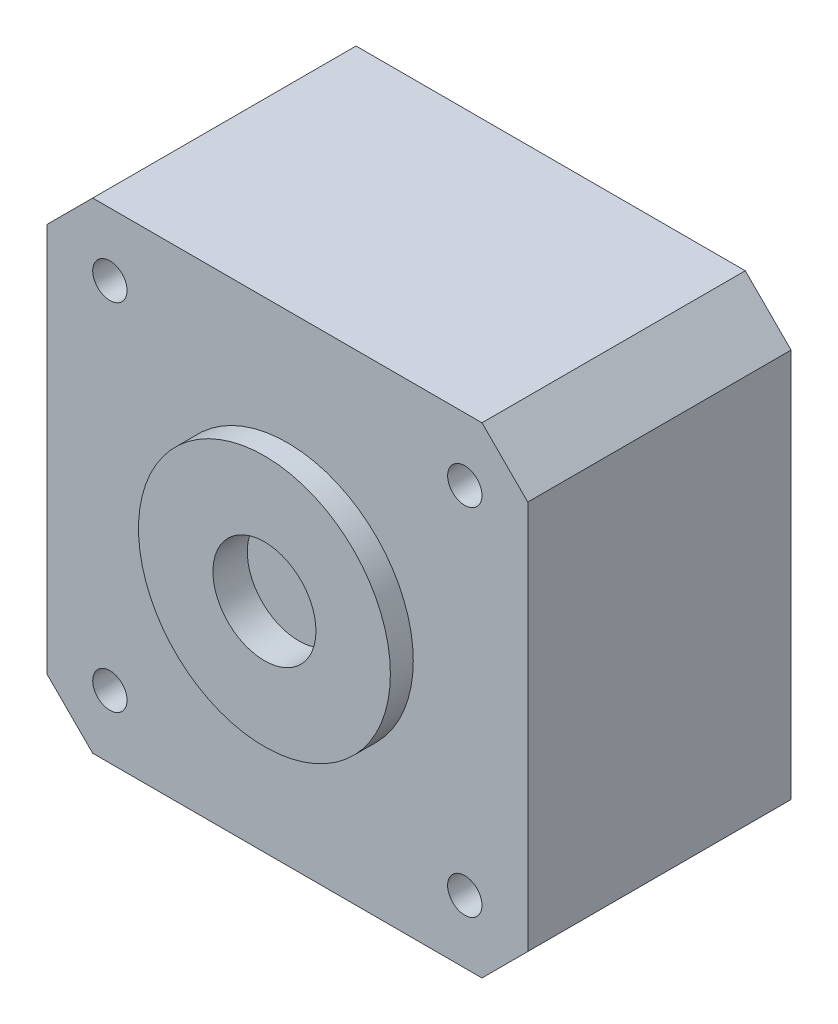
ISO-10303-21;
HEADER;
FILE_DESCRIPTION(('STEP AP214'),'2;1');
FILE_NAME('part.step','',(''),(''),'','','');
FILE_SCHEMA(('AUTOMOTIVE_DESIGN { 1 0 10303 214 1 1 1 1 }'));
ENDSEC;
DATA;
#1=APPLICATION_CONTEXT('core data for automotive mechanical design processes');
#2=APPLICATION_PROTOCOL_DEFINITION('international standard','automotive_design',2000,#1);
#3=PRODUCT_CONTEXT('',#1,'mechanical');
#4=PRODUCT('Part','Part','',(#3));
#5=PRODUCT_RELATED_PRODUCT_CATEGORY('part','',(#4));
#6=PRODUCT_DEFINITION_FORMATION('','',#4);
#7=PRODUCT_DEFINITION_CONTEXT('part definition',#1,'design');
#8=PRODUCT_DEFINITION('design','',#6,#7);
#9=PRODUCT_DEFINITION_SHAPE('','',#8);
#10=(LENGTH_UNIT() NAMED_UNIT(*) SI_UNIT(.MILLI.,.METRE.));
#11=(NAMED_UNIT(*) PLANE_ANGLE_UNIT() SI_UNIT($,.RADIAN.));
#12=(NAMED_UNIT(*) SI_UNIT($,.STERADIAN.) SOLID_ANGLE_UNIT());
#13=UNCERTAINTY_MEASURE_WITH_UNIT(LENGTH_MEASURE(1.E-05),#10,'distance_accuracy_value','');
#14=(GEOMETRIC_REPRESENTATION_CONTEXT(3) GLOBAL_UNCERTAINTY_ASSIGNED_CONTEXT((#13)) GLOBAL_UNIT_ASSIGNED_CONTEXT((#10,
#11,#12)) REPRESENTATION_CONTEXT('',''));
#15=CARTESIAN_POINT('',(0.,0.,0.));
#16=DIRECTION('',(0.,0.,1.));
#17=DIRECTION('',(1.,0.,0.));
#18=AXIS2_PLACEMENT_3D('',#15,#16,#17);
#19=CARTESIAN_POINT('',(15.5,-15.5,23.));
#20=DIRECTION('',(0.,0.,-1.));
#21=DIRECTION('',(-1.,0.,0.));
#22=AXIS2_PLACEMENT_3D('',#19,#20,#21);
#23=CYLINDRICAL_SURFACE('',#22,1.5);
#24=CARTESIAN_POINT('',(15.5,-15.5,23.));
#25=DIRECTION('',(0.,0.,1.));
#26=DIRECTION('',(1.,0.,0.));
#27=AXIS2_PLACEMENT_3D('',#24,#25,#26);
#28=CIRCLE('',#27,1.5);
#29=CARTESIAN_POINT('',(17.,-15.5,23.));
#30=VERTEX_POINT('',#29);
#31=EDGE_CURVE('E168',#30,#30,#28,.F.);
#32=ORIENTED_EDGE('',*,*,#31,.F.);
#33=EDGE_LOOP('',(#32));
#34=FACE_BOUND('',#33,.T.);
#35=CARTESIAN_POINT('',(15.5,-15.5,19.5));
#36=DIRECTION('',(0.,0.,-1.));
#37=DIRECTION('',(-1.,0.,0.));
#38=AXIS2_PLACEMENT_3D('',#35,#36,#37);
#39=CIRCLE('',#38,1.5);
#40=CARTESIAN_POINT('',(14.,-15.5,19.5));
#41=VERTEX_POINT('',#40);
#42=EDGE_CURVE('E12',#41,#41,#39,.F.);
#43=ORIENTED_EDGE('',*,*,#42,.F.);
#44=EDGE_LOOP('',(#43));
#45=FACE_BOUND('',#44,.T.);
#46=ADVANCED_FACE('F68',(#34,#45),#23,.F.);
#47=CARTESIAN_POINT('',(-15.5,-15.5,23.));
#48=DIRECTION('',(0.,0.,-1.));
#49=DIRECTION('',(-1.,0.,0.));
#50=AXIS2_PLACEMENT_3D('',#47,#48,#49);
#51=CYLINDRICAL_SURFACE('',#50,1.5);
#52=CARTESIAN_POINT('',(-15.5,-15.5,23.));
#53=DIRECTION('',(0.,0.,1.));
#54=DIRECTION('',(1.,0.,0.));
#55=AXIS2_PLACEMENT_3D('',#52,#53,#54);
#56=CIRCLE('',#55,1.5);
#57=CARTESIAN_POINT('',(-14.,-15.5,23.));
#58=VERTEX_POINT('',#57);
#59=EDGE_CURVE('E191',#58,#58,#56,.F.);
#60=ORIENTED_EDGE('',*,*,#59,.F.);
#61=EDGE_LOOP('',(#60));
#62=FACE_BOUND('',#61,.T.);
#63=CARTESIAN_POINT('',(-15.5,-15.5,19.5));
#64=DIRECTION('',(0.,0.,-1.));
#65=DIRECTION('',(-1.,0.,0.));
#66=AXIS2_PLACEMENT_3D('',#63,#64,#65);
#67=CIRCLE('',#66,1.5);
#68=CARTESIAN_POINT('',(-17.,-15.5,19.5));
#69=VERTEX_POINT('',#68);
#70=EDGE_CURVE('E204',#69,#69,#67,.F.);
#71=ORIENTED_EDGE('',*,*,#70,.F.);
#72=EDGE_LOOP('',(#71));
#73=FACE_BOUND('',#72,.T.);
#74=ADVANCED_FACE('F70',(#62,#73),#51,.F.);
#75=CARTESIAN_POINT('',(0.,-21.,23.));
#76=DIRECTION('',(0.,1.,0.));
#77=DIRECTION('',(0.,0.,1.));
#78=AXIS2_PLACEMENT_3D('',#75,#76,#77);
#79=PLANE('',#78);
#80=DIRECTION('',(1.,0.,0.));
#81=VECTOR('',#80,1.);
#82=CARTESIAN_POINT('',(0.,-21.,0.));
#83=LINE('',#82,#81);
#84=CARTESIAN_POINT('',(-17.,-21.,0.));
#85=VERTEX_POINT('',#84);
#86=CARTESIAN_POINT('',(16.9999999999999,-21.,0.));
#87=VERTEX_POINT('',#86);
#88=EDGE_CURVE('E173',#85,#87,#83,.T.);
#89=ORIENTED_EDGE('',*,*,#88,.T.);
#90=DIRECTION('',(0.,0.,-1.));
#91=VECTOR('',#90,1.);
#92=CARTESIAN_POINT('',(16.9999999999999,-21.,23.));
#93=LINE('',#92,#91);
#94=CARTESIAN_POINT('',(16.9999999999999,-21.,23.));
#95=VERTEX_POINT('',#94);
#96=EDGE_CURVE('E200',#95,#87,#93,.T.);
#97=ORIENTED_EDGE('',*,*,#96,.F.);
#98=DIRECTION('',(1.,0.,0.));
#99=VECTOR('',#98,1.);
#100=CARTESIAN_POINT('',(0.,-21.,23.));
#101=LINE('',#100,#99);
#102=CARTESIAN_POINT('',(-17.,-21.,23.));
#103=VERTEX_POINT('',#102);
#104=EDGE_CURVE('E228',#103,#95,#101,.T.);
#105=ORIENTED_EDGE('',*,*,#104,.F.);
#106=DIRECTION('',(0.,0.,-1.));
#107=VECTOR('',#106,1.);
#108=CARTESIAN_POINT('',(-17.,-21.,23.));
#109=LINE('',#108,#107);
#110=EDGE_CURVE('E122',#103,#85,#109,.T.);
#111=ORIENTED_EDGE('',*,*,#110,.T.);
#112=EDGE_LOOP('',(#89,#97,#105,#111));
#113=FACE_BOUND('',#112,.T.);
#114=ADVANCED_FACE('F263',(#113),#79,.F.);
#115=CARTESIAN_POINT('',(18.9999999999999,-19.,23.));
#116=DIRECTION('',(-0.707106781186546,0.707106781186549,0.));
#117=DIRECTION('',(-0.707106781186549,-0.707106781186546,0.));
#118=AXIS2_PLACEMENT_3D('',#115,#116,#117);
#119=PLANE('',#118);
#120=DIRECTION('',(0.707106781186549,0.707106781186546,0.));
#121=VECTOR('',#120,1.);
#122=CARTESIAN_POINT('',(18.9999999999999,-19.,0.));
#123=LINE('',#122,#121);
#124=CARTESIAN_POINT('',(21.,-16.9999999999999,0.));
#125=VERTEX_POINT('',#124);
#126=EDGE_CURVE('E176',#87,#125,#123,.T.);
#127=ORIENTED_EDGE('',*,*,#126,.T.);
#128=DIRECTION('',(0.,0.,-1.));
#129=VECTOR('',#128,1.);
#130=CARTESIAN_POINT('',(21.,-16.9999999999999,23.));
#131=LINE('',#130,#129);
#132=CARTESIAN_POINT('',(21.,-16.9999999999999,23.));
#133=VERTEX_POINT('',#132);
#134=EDGE_CURVE('E197',#133,#125,#131,.T.);
#135=ORIENTED_EDGE('',*,*,#134,.F.);
#136=DIRECTION('',(0.707106781186549,0.707106781186546,0.));
#137=VECTOR('',#136,1.);
#138=CARTESIAN_POINT('',(18.9999999999999,-19.,23.));
#139=LINE('',#138,#137);
#140=EDGE_CURVE('E236',#95,#133,#139,.T.);
#141=ORIENTED_EDGE('',*,*,#140,.F.);
#142=ORIENTED_EDGE('',*,*,#96,.T.);
#143=EDGE_LOOP('',(#127,#135,#141,#142));
#144=FACE_BOUND('',#143,.T.);
#145=ADVANCED_FACE('F330',(#144),#119,.F.);
#146=CARTESIAN_POINT('',(21.,0.,23.));
#147=DIRECTION('',(-1.,0.,0.));
#148=DIRECTION('',(0.,0.,1.));
#149=AXIS2_PLACEMENT_3D('',#146,#147,#148);
#150=PLANE('',#149);
#151=DIRECTION('',(0.,1.,0.));
#152=VECTOR('',#151,1.);
#153=CARTESIAN_POINT('',(21.,0.,0.));
#154=LINE('',#153,#152);
#155=CARTESIAN_POINT('',(21.,16.9999999999999,0.));
#156=VERTEX_POINT('',#155);
#157=EDGE_CURVE('E179',#125,#156,#154,.T.);
#158=ORIENTED_EDGE('',*,*,#157,.T.);
#159=DIRECTION('',(0.,0.,-1.));
#160=VECTOR('',#159,1.);
#161=CARTESIAN_POINT('',(21.,16.9999999999999,23.));
#162=LINE('',#161,#160);
#163=CARTESIAN_POINT('',(21.,16.9999999999999,23.));
#164=VERTEX_POINT('',#163);
#165=EDGE_CURVE('E195',#164,#156,#162,.T.);
#166=ORIENTED_EDGE('',*,*,#165,.F.);
#167=DIRECTION('',(0.,1.,0.));
#168=VECTOR('',#167,1.);
#169=CARTESIAN_POINT('',(21.,0.,23.));
#170=LINE('',#169,#168);
#171=EDGE_CURVE('E163',#133,#164,#170,.T.);
#172=ORIENTED_EDGE('',*,*,#171,.F.);
#173=ORIENTED_EDGE('',*,*,#134,.T.);
#174=EDGE_LOOP('',(#158,#166,#172,#173));
#175=FACE_BOUND('',#174,.T.);
#176=ADVANCED_FACE('F241',(#175),#150,.F.);
#177=CARTESIAN_POINT('',(18.9999999999999,19.,23.));
#178=DIRECTION('',(0.707106781186546,0.707106781186549,0.));
#179=DIRECTION('',(-0.707106781186549,0.707106781186546,0.));
#180=AXIS2_PLACEMENT_3D('',#177,#178,#179);
#181=PLANE('',#180);
#182=DIRECTION('',(0.707106781186549,-0.707106781186546,0.));
#183=VECTOR('',#182,1.);
#184=CARTESIAN_POINT('',(18.9999999999999,19.,0.));
#185=LINE('',#184,#183);
#186=CARTESIAN_POINT('',(16.9999999999999,21.,0.));
#187=VERTEX_POINT('',#186);
#188=EDGE_CURVE('E182',#187,#156,#185,.T.);
#189=ORIENTED_EDGE('',*,*,#188,.F.);
#190=DIRECTION('',(0.,0.,-1.));
#191=VECTOR('',#190,1.);
#192=CARTESIAN_POINT('',(16.9999999999999,21.,23.));
#193=LINE('',#192,#191);
#194=CARTESIAN_POINT('',(16.9999999999999,21.,23.));
#195=VERTEX_POINT('',#194);
#196=EDGE_CURVE('E148',#195,#187,#193,.T.);
#197=ORIENTED_EDGE('',*,*,#196,.F.);
#198=DIRECTION('',(0.707106781186549,-0.707106781186546,0.));
#199=VECTOR('',#198,1.);
#200=CARTESIAN_POINT('',(18.9999999999999,19.,23.));
#201=LINE('',#200,#199);
#202=EDGE_CURVE('E161',#195,#164,#201,.T.);
#203=ORIENTED_EDGE('',*,*,#202,.T.);
#204=ORIENTED_EDGE('',*,*,#165,.T.);
#205=EDGE_LOOP('',(#189,#197,#203,#204));
#206=FACE_BOUND('',#205,.T.);
#207=ADVANCED_FACE('F244',(#206),#181,.T.);
#208=CARTESIAN_POINT('',(0.,21.,23.));
#209=DIRECTION('',(0.,1.,0.));
#210=DIRECTION('',(0.,0.,1.));
#211=AXIS2_PLACEMENT_3D('',#208,#209,#210);
#212=PLANE('',#211);
#213=DIRECTION('',(1.,0.,0.));
#214=VECTOR('',#213,1.);
#215=CARTESIAN_POINT('',(0.,21.,0.));
#216=LINE('',#215,#214);
#217=CARTESIAN_POINT('',(-17.,21.,0.));
#218=VERTEX_POINT('',#217);
#219=EDGE_CURVE('E145',#218,#187,#216,.T.);
#220=ORIENTED_EDGE('',*,*,#219,.F.);
#221=DIRECTION('',(0.,0.,-1.));
#222=VECTOR('',#221,1.);
#223=CARTESIAN_POINT('',(-17.,21.,23.));
#224=LINE('',#223,#222);
#225=CARTESIAN_POINT('',(-17.,21.,23.));
#226=VERTEX_POINT('',#225);
#227=EDGE_CURVE('E139',#226,#218,#224,.T.);
#228=ORIENTED_EDGE('',*,*,#227,.F.);
#229=DIRECTION('',(1.,0.,0.));
#230=VECTOR('',#229,1.);
#231=CARTESIAN_POINT('',(0.,21.,23.));
#232=LINE('',#231,#230);
#233=EDGE_CURVE('E143',#226,#195,#232,.T.);
#234=ORIENTED_EDGE('',*,*,#233,.T.);
#235=ORIENTED_EDGE('',*,*,#196,.T.);
#236=EDGE_LOOP('',(#220,#228,#234,#235));
#237=FACE_BOUND('',#236,.T.);
#238=ADVANCED_FACE('F141',(#237),#212,.T.);
#239=CARTESIAN_POINT('',(-19.,19.,23.));
#240=DIRECTION('',(0.707106781186547,-0.707106781186547,0.));
#241=DIRECTION('',(0.707106781186548,0.707106781186548,0.));
#242=AXIS2_PLACEMENT_3D('',#239,#240,#241);
#243=PLANE('',#242);
#244=DIRECTION('',(-0.707106781186548,-0.707106781186548,0.));
#245=VECTOR('',#244,1.);
#246=CARTESIAN_POINT('',(-19.,19.,0.));
#247=LINE('',#246,#245);
#248=CARTESIAN_POINT('',(-21.,17.,0.));
#249=VERTEX_POINT('',#248);
#250=EDGE_CURVE('E186',#218,#249,#247,.T.);
#251=ORIENTED_EDGE('',*,*,#250,.T.);
#252=DIRECTION('',(0.,0.,-1.));
#253=VECTOR('',#252,1.);
#254=CARTESIAN_POINT('',(-21.,17.,23.));
#255=LINE('',#254,#253);
#256=CARTESIAN_POINT('',(-21.,17.,23.));
#257=VERTEX_POINT('',#256);
#258=EDGE_CURVE('E113',#257,#249,#255,.T.);
#259=ORIENTED_EDGE('',*,*,#258,.F.);
#260=DIRECTION('',(-0.707106781186548,-0.707106781186548,0.));
#261=VECTOR('',#260,1.);
#262=CARTESIAN_POINT('',(-19.,19.,23.));
#263=LINE('',#262,#261);
#264=EDGE_CURVE('E150',#226,#257,#263,.T.);
#265=ORIENTED_EDGE('',*,*,#264,.F.);
#266=ORIENTED_EDGE('',*,*,#227,.T.);
#267=EDGE_LOOP('',(#251,#259,#265,#266));
#268=FACE_BOUND('',#267,.T.);
#269=ADVANCED_FACE('F151',(#268),#243,.F.);
#270=CARTESIAN_POINT('',(-21.,0.,23.));
#271=DIRECTION('',(-1.,0.,0.));
#272=DIRECTION('',(0.,0.,1.));
#273=AXIS2_PLACEMENT_3D('',#270,#271,#272);
#274=PLANE('',#273);
#275=DIRECTION('',(0.,1.,0.));
#276=VECTOR('',#275,1.);
#277=CARTESIAN_POINT('',(-21.,0.,0.));
#278=LINE('',#277,#276);
#279=CARTESIAN_POINT('',(-21.,-17.,0.));
#280=VERTEX_POINT('',#279);
#281=EDGE_CURVE('E188',#280,#249,#278,.T.);
#282=ORIENTED_EDGE('',*,*,#281,.F.);
#283=DIRECTION('',(0.,0.,-1.));
#284=VECTOR('',#283,1.);
#285=CARTESIAN_POINT('',(-21.,-17.,23.));
#286=LINE('',#285,#284);
#287=CARTESIAN_POINT('',(-21.,-17.,23.));
#288=VERTEX_POINT('',#287);
#289=EDGE_CURVE('E86',#288,#280,#286,.T.);
#290=ORIENTED_EDGE('',*,*,#289,.F.);
#291=DIRECTION('',(0.,1.,0.));
#292=VECTOR('',#291,1.);
#293=CARTESIAN_POINT('',(-21.,0.,23.));
#294=LINE('',#293,#292);
#295=EDGE_CURVE('E154',#288,#257,#294,.T.);
#296=ORIENTED_EDGE('',*,*,#295,.T.);
#297=ORIENTED_EDGE('',*,*,#258,.T.);
#298=EDGE_LOOP('',(#282,#290,#296,#297));
#299=FACE_BOUND('',#298,.T.);
#300=ADVANCED_FACE('F248',(#299),#274,.T.);
#301=CARTESIAN_POINT('',(-19.,-19.,23.));
#302=DIRECTION('',(-0.707106781186547,-0.707106781186547,0.));
#303=DIRECTION('',(0.707106781186548,-0.707106781186548,0.));
#304=AXIS2_PLACEMENT_3D('',#301,#302,#303);
#305=PLANE('',#304);
#306=DIRECTION('',(-0.707106781186548,0.707106781186548,0.));
#307=VECTOR('',#306,1.);
#308=CARTESIAN_POINT('',(-19.,-19.,0.));
#309=LINE('',#308,#307);
#310=EDGE_CURVE('E171',#85,#280,#309,.T.);
#311=ORIENTED_EDGE('',*,*,#310,.F.);
#312=ORIENTED_EDGE('',*,*,#110,.F.);
#313=DIRECTION('',(-0.707106781186548,0.707106781186548,0.));
#314=VECTOR('',#313,1.);
#315=CARTESIAN_POINT('',(-19.,-19.,23.));
#316=LINE('',#315,#314);
#317=EDGE_CURVE('E225',#103,#288,#316,.T.);
#318=ORIENTED_EDGE('',*,*,#317,.T.);
#319=ORIENTED_EDGE('',*,*,#289,.T.);
#320=EDGE_LOOP('',(#311,#312,#318,#319));
#321=FACE_BOUND('',#320,.T.);
#322=ADVANCED_FACE('F219',(#321),#305,.T.);
#323=CARTESIAN_POINT('',(-15.5,15.5,23.));
#324=DIRECTION('',(0.,0.,-1.));
#325=DIRECTION('',(-1.,0.,0.));
#326=AXIS2_PLACEMENT_3D('',#323,#324,#325);
#327=CYLINDRICAL_SURFACE('',#326,1.5);
#328=CARTESIAN_POINT('',(-15.5,15.5,19.5));
#329=DIRECTION('',(0.,0.,1.));
#330=DIRECTION('',(1.,0.,0.));
#331=AXIS2_PLACEMENT_3D('',#328,#329,#330);
#332=CIRCLE('',#331,1.5);
#333=CARTESIAN_POINT('',(-14.,15.5,19.5));
#334=VERTEX_POINT('',#333);
#335=EDGE_CURVE('E78',#334,#334,#332,.T.);
#336=ORIENTED_EDGE('',*,*,#335,.F.);
#337=EDGE_LOOP('',(#336));
#338=FACE_BOUND('',#337,.T.);
#339=CARTESIAN_POINT('',(-15.5,15.5,23.));
#340=DIRECTION('',(0.,0.,1.));
#341=DIRECTION('',(1.,0.,0.));
#342=AXIS2_PLACEMENT_3D('',#339,#340,#341);
#343=CIRCLE('',#342,1.5);
#344=CARTESIAN_POINT('',(-14.,15.5,23.));
#345=VERTEX_POINT('',#344);
#346=EDGE_CURVE('E223',#345,#345,#343,.T.);
#347=ORIENTED_EDGE('',*,*,#346,.T.);
#348=EDGE_LOOP('',(#347));
#349=FACE_BOUND('',#348,.T.);
#350=ADVANCED_FACE('F215',(#338,#349),#327,.F.);
#351=CARTESIAN_POINT('',(15.5,15.5,23.));
#352=DIRECTION('',(0.,0.,-1.));
#353=DIRECTION('',(-1.,0.,0.));
#354=AXIS2_PLACEMENT_3D('',#351,#352,#353);
#355=CYLINDRICAL_SURFACE('',#354,1.5);
#356=CARTESIAN_POINT('',(15.5,15.5,19.5));
#357=DIRECTION('',(0.,0.,1.));
#358=DIRECTION('',(1.,0.,0.));
#359=AXIS2_PLACEMENT_3D('',#356,#357,#358);
#360=CIRCLE('',#359,1.5);
#361=CARTESIAN_POINT('',(17.,15.5,19.5));
#362=VERTEX_POINT('',#361);
#363=EDGE_CURVE('E207',#362,#362,#360,.T.);
#364=ORIENTED_EDGE('',*,*,#363,.F.);
#365=EDGE_LOOP('',(#364));
#366=FACE_BOUND('',#365,.T.);
#367=CARTESIAN_POINT('',(15.5,15.5,23.));
#368=DIRECTION('',(0.,0.,1.));
#369=DIRECTION('',(1.,0.,0.));
#370=AXIS2_PLACEMENT_3D('',#367,#368,#369);
#371=CIRCLE('',#370,1.5);
#372=CARTESIAN_POINT('',(17.,15.5,23.));
#373=VERTEX_POINT('',#372);
#374=EDGE_CURVE('E226',#373,#373,#371,.T.);
#375=ORIENTED_EDGE('',*,*,#374,.T.);
#376=EDGE_LOOP('',(#375));
#377=FACE_BOUND('',#376,.T.);
#378=ADVANCED_FACE('F218',(#366,#377),#355,.F.);
#379=CARTESIAN_POINT('',(0.,0.,0.));
#380=DIRECTION('',(0.,0.,1.));
#381=DIRECTION('',(1.,0.,0.));
#382=AXIS2_PLACEMENT_3D('',#379,#380,#381);
#383=PLANE('',#382);
#384=ORIENTED_EDGE('',*,*,#310,.T.);
#385=ORIENTED_EDGE('',*,*,#281,.T.);
#386=ORIENTED_EDGE('',*,*,#250,.F.);
#387=ORIENTED_EDGE('',*,*,#219,.T.);
#388=ORIENTED_EDGE('',*,*,#188,.T.);
#389=ORIENTED_EDGE('',*,*,#157,.F.);
#390=ORIENTED_EDGE('',*,*,#126,.F.);
#391=ORIENTED_EDGE('',*,*,#88,.F.);
#392=EDGE_LOOP('',(#384,#385,#386,#387,#388,#389,#390,#391));
#393=FACE_BOUND('',#392,.T.);
#394=ADVANCED_FACE('F246',(#393),#383,.F.);
#395=CARTESIAN_POINT('',(0.,0.,23.));
#396=DIRECTION('',(0.,0.,1.));
#397=DIRECTION('',(1.,0.,0.));
#398=AXIS2_PLACEMENT_3D('',#395,#396,#397);
#399=PLANE('',#398);
#400=CARTESIAN_POINT('',(0.,0.,23.));
#401=DIRECTION('',(0.,0.,1.));
#402=DIRECTION('',(1.,0.,0.));
#403=AXIS2_PLACEMENT_3D('',#400,#401,#402);
#404=CIRCLE('',#403,11.);
#405=CARTESIAN_POINT('',(11.,0.,23.));
#406=VERTEX_POINT('',#405);
#407=EDGE_CURVE('E72',#406,#406,#404,.F.);
#408=ORIENTED_EDGE('',*,*,#407,.T.);
#409=EDGE_LOOP('',(#408));
#410=FACE_BOUND('',#409,.T.);
#411=ORIENTED_EDGE('',*,*,#59,.T.);
#412=EDGE_LOOP('',(#411));
#413=FACE_BOUND('',#412,.T.);
#414=ORIENTED_EDGE('',*,*,#374,.F.);
#415=EDGE_LOOP('',(#414));
#416=FACE_BOUND('',#415,.T.);
#417=ORIENTED_EDGE('',*,*,#346,.F.);
#418=EDGE_LOOP('',(#417));
#419=FACE_BOUND('',#418,.T.);
#420=ORIENTED_EDGE('',*,*,#317,.F.);
#421=ORIENTED_EDGE('',*,*,#104,.T.);
#422=ORIENTED_EDGE('',*,*,#140,.T.);
#423=ORIENTED_EDGE('',*,*,#171,.T.);
#424=ORIENTED_EDGE('',*,*,#202,.F.);
#425=ORIENTED_EDGE('',*,*,#233,.F.);
#426=ORIENTED_EDGE('',*,*,#264,.T.);
#427=ORIENTED_EDGE('',*,*,#295,.F.);
#428=EDGE_LOOP('',(#420,#421,#422,#423,#424,#425,#426,#427));
#429=FACE_BOUND('',#428,.T.);
#430=ORIENTED_EDGE('',*,*,#31,.T.);
#431=EDGE_LOOP('',(#430));
#432=FACE_BOUND('',#431,.T.);
#433=ADVANCED_FACE('F158',(#410,#413,#416,#419,#429,#432),#399,.T.);
#434=CARTESIAN_POINT('',(-15.5,-15.5,19.5));
#435=DIRECTION('',(0.,0.,-1.));
#436=DIRECTION('',(-1.,0.,0.));
#437=AXIS2_PLACEMENT_3D('',#434,#435,#436);
#438=PLANE('',#437);
#439=ORIENTED_EDGE('',*,*,#70,.T.);
#440=EDGE_LOOP('',(#439));
#441=FACE_BOUND('',#440,.T.);
#442=ADVANCED_FACE('F272',(#441),#438,.F.);
#443=CARTESIAN_POINT('',(15.5,15.5,19.5));
#444=DIRECTION('',(0.,0.,1.));
#445=DIRECTION('',(1.,0.,0.));
#446=AXIS2_PLACEMENT_3D('',#443,#444,#445);
#447=PLANE('',#446);
#448=ORIENTED_EDGE('',*,*,#363,.T.);
#449=EDGE_LOOP('',(#448));
#450=FACE_BOUND('',#449,.T.);
#451=ADVANCED_FACE('F277',(#450),#447,.T.);
#452=CARTESIAN_POINT('',(0.,0.,19.5));
#453=DIRECTION('',(0.,0.,1.));
#454=DIRECTION('',(1.,0.,0.));
#455=AXIS2_PLACEMENT_3D('',#452,#453,#454);
#456=PLANE('',#455);
#457=ORIENTED_EDGE('',*,*,#335,.T.);
#458=EDGE_LOOP('',(#457));
#459=FACE_BOUND('',#458,.T.);
#460=ADVANCED_FACE('F213',(#459),#456,.T.);
#461=CARTESIAN_POINT('',(15.5,-15.5,19.5));
#462=DIRECTION('',(0.,0.,-1.));
#463=DIRECTION('',(-1.,0.,0.));
#464=AXIS2_PLACEMENT_3D('',#461,#462,#463);
#465=PLANE('',#464);
#466=ORIENTED_EDGE('',*,*,#42,.T.);
#467=EDGE_LOOP('',(#466));
#468=FACE_BOUND('',#467,.T.);
#469=ADVANCED_FACE('F276',(#468),#465,.F.);
#470=CARTESIAN_POINT('',(0.,0.,25.));
#471=DIRECTION('',(0.,0.,-1.));
#472=DIRECTION('',(-1.,0.,0.));
#473=AXIS2_PLACEMENT_3D('',#470,#471,#472);
#474=CYLINDRICAL_SURFACE('',#473,11.);
#475=ORIENTED_EDGE('',*,*,#407,.F.);
#476=EDGE_LOOP('',(#475));
#477=FACE_BOUND('',#476,.T.);
#478=CARTESIAN_POINT('',(0.,0.,25.));
#479=DIRECTION('',(0.,0.,1.));
#480=DIRECTION('',(1.,0.,0.));
#481=AXIS2_PLACEMENT_3D('',#478,#479,#480);
#482=CIRCLE('',#481,11.);
#483=CARTESIAN_POINT('',(11.,0.,25.));
#484=VERTEX_POINT('',#483);
#485=EDGE_CURVE('E307',#484,#484,#482,.T.);
#486=ORIENTED_EDGE('',*,*,#485,.F.);
#487=EDGE_LOOP('',(#486));
#488=FACE_BOUND('',#487,.T.);
#489=ADVANCED_FACE('F286',(#477,#488),#474,.T.);
#490=CARTESIAN_POINT('',(0.,0.,25.));
#491=DIRECTION('',(0.,0.,1.));
#492=DIRECTION('',(1.,0.,0.));
#493=AXIS2_PLACEMENT_3D('',#490,#491,#492);
#494=PLANE('',#493);
#495=CARTESIAN_POINT('',(0.,0.,25.));
#496=DIRECTION('',(0.,0.,1.));
#497=DIRECTION('',(1.,0.,0.));
#498=AXIS2_PLACEMENT_3D('',#495,#496,#497);
#499=CIRCLE('',#498,4.5);
#500=CARTESIAN_POINT('',(4.5,0.,25.));
#501=VERTEX_POINT('',#500);
#502=EDGE_CURVE('E308',#501,#501,#499,.T.);
#503=ORIENTED_EDGE('',*,*,#502,.F.);
#504=EDGE_LOOP('',(#503));
#505=FACE_BOUND('',#504,.T.);
#506=ORIENTED_EDGE('',*,*,#485,.T.);
#507=EDGE_LOOP('',(#506));
#508=FACE_BOUND('',#507,.T.);
#509=ADVANCED_FACE('F290',(#505,#508),#494,.T.);
#510=CARTESIAN_POINT('',(0.,0.,22.));
#511=DIRECTION('',(0.,0.,1.));
#512=DIRECTION('',(1.,0.,0.));
#513=AXIS2_PLACEMENT_3D('',#510,#511,#512);
#514=CYLINDRICAL_SURFACE('',#513,4.5);
#515=CARTESIAN_POINT('',(0.,0.,22.));
#516=DIRECTION('',(0.,0.,1.));
#517=DIRECTION('',(1.,0.,0.));
#518=AXIS2_PLACEMENT_3D('',#515,#516,#517);
#519=CIRCLE('',#518,4.5);
#520=CARTESIAN_POINT('',(4.5,0.,22.));
#521=VERTEX_POINT('',#520);
#522=EDGE_CURVE('E306',#521,#521,#519,.T.);
#523=ORIENTED_EDGE('',*,*,#522,.F.);
#524=EDGE_LOOP('',(#523));
#525=FACE_BOUND('',#524,.T.);
#526=ORIENTED_EDGE('',*,*,#502,.T.);
#527=EDGE_LOOP('',(#526));
#528=FACE_BOUND('',#527,.T.);
#529=ADVANCED_FACE('F294',(#525,#528),#514,.F.);
#530=CARTESIAN_POINT('',(0.,0.,22.));
#531=DIRECTION('',(0.,0.,1.));
#532=DIRECTION('',(1.,0.,0.));
#533=AXIS2_PLACEMENT_3D('',#530,#531,#532);
#534=PLANE('',#533);
#535=ORIENTED_EDGE('',*,*,#522,.T.);
#536=EDGE_LOOP('',(#535));
#537=FACE_BOUND('',#536,.T.);
#538=ADVANCED_FACE('F298',(#537),#534,.T.);
#539=CLOSED_SHELL('',(#46,#74,#114,#145,#176,#207,#238,#269,#300,#322,#350,#378,#394,#433,#442,
#451,#460,#469,#489,#509,#529,#538));
#540=MANIFOLD_SOLID_BREP('B2',#539);
#541=ADVANCED_BREP_SHAPE_REPRESENTATION('',(#18,#540),#14);
#542=SHAPE_DEFINITION_REPRESENTATION(#9,#541);
ENDSEC;
END-ISO-10303-21;
